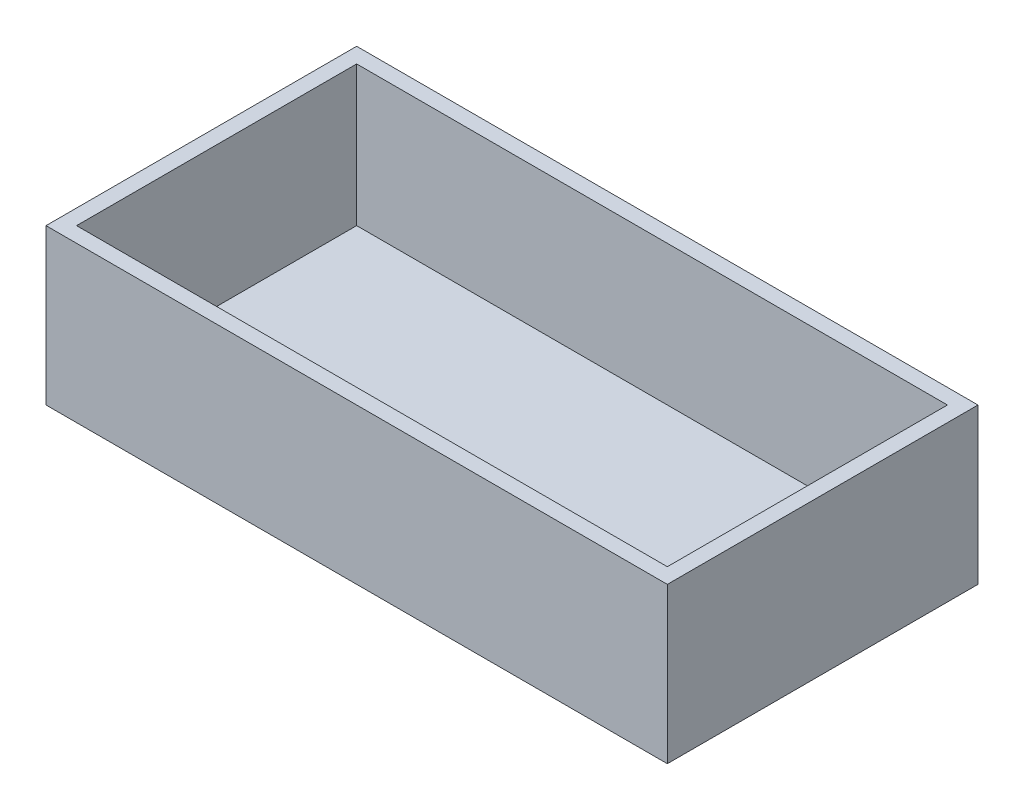
ISO-10303-21;
HEADER;
FILE_DESCRIPTION(('STEP AP214'),'2;1');
FILE_NAME('part.step','',(''),(''),'','','');
FILE_SCHEMA(('AUTOMOTIVE_DESIGN { 1 0 10303 214 1 1 1 1 }'));
ENDSEC;
DATA;
#1=APPLICATION_CONTEXT('core data for automotive mechanical design processes');
#2=APPLICATION_PROTOCOL_DEFINITION('international standard','automotive_design',2000,#1);
#3=PRODUCT_CONTEXT('',#1,'mechanical');
#4=PRODUCT('Part','Part','',(#3));
#5=PRODUCT_RELATED_PRODUCT_CATEGORY('part','',(#4));
#6=PRODUCT_DEFINITION_FORMATION('','',#4);
#7=PRODUCT_DEFINITION_CONTEXT('part definition',#1,'design');
#8=PRODUCT_DEFINITION('design','',#6,#7);
#9=PRODUCT_DEFINITION_SHAPE('','',#8);
#10=(LENGTH_UNIT() NAMED_UNIT(*) SI_UNIT(.MILLI.,.METRE.));
#11=(NAMED_UNIT(*) PLANE_ANGLE_UNIT() SI_UNIT($,.RADIAN.));
#12=(NAMED_UNIT(*) SI_UNIT($,.STERADIAN.) SOLID_ANGLE_UNIT());
#13=UNCERTAINTY_MEASURE_WITH_UNIT(LENGTH_MEASURE(1.E-05),#10,'distance_accuracy_value','');
#14=(GEOMETRIC_REPRESENTATION_CONTEXT(3) GLOBAL_UNCERTAINTY_ASSIGNED_CONTEXT((#13)) GLOBAL_UNIT_ASSIGNED_CONTEXT((#10,
#11,#12)) REPRESENTATION_CONTEXT('',''));
#15=CARTESIAN_POINT('',(0.,0.,0.));
#16=DIRECTION('',(0.,0.,1.));
#17=DIRECTION('',(1.,0.,0.));
#18=AXIS2_PLACEMENT_3D('',#15,#16,#17);
#19=CARTESIAN_POINT('',(0.,50.8,0.));
#20=DIRECTION('',(0.,-1.,0.));
#21=DIRECTION('',(0.,0.,-1.));
#22=AXIS2_PLACEMENT_3D('',#19,#20,#21);
#23=PLANE('',#22);
#24=DIRECTION('',(0.,0.,-1.));
#25=VECTOR('',#24,1.);
#26=CARTESIAN_POINT('',(101.6,50.8,50.8));
#27=LINE('',#26,#25);
#28=CARTESIAN_POINT('',(101.6,50.8,50.8));
#29=VERTEX_POINT('',#28);
#30=CARTESIAN_POINT('',(101.6,50.8,-50.8));
#31=VERTEX_POINT('',#30);
#32=EDGE_CURVE('E163',#29,#31,#27,.T.);
#33=ORIENTED_EDGE('',*,*,#32,.T.);
#34=DIRECTION('',(-1.,0.,0.));
#35=VECTOR('',#34,1.);
#36=CARTESIAN_POINT('',(-101.6,50.8,-50.8));
#37=LINE('',#36,#35);
#38=CARTESIAN_POINT('',(-101.6,50.8,-50.8));
#39=VERTEX_POINT('',#38);
#40=EDGE_CURVE('E98',#31,#39,#37,.T.);
#41=ORIENTED_EDGE('',*,*,#40,.T.);
#42=DIRECTION('',(0.,0.,1.));
#43=VECTOR('',#42,1.);
#44=CARTESIAN_POINT('',(-101.6,50.8,50.8));
#45=LINE('',#44,#43);
#46=CARTESIAN_POINT('',(-101.6,50.8,50.8));
#47=VERTEX_POINT('',#46);
#48=EDGE_CURVE('E168',#39,#47,#45,.T.);
#49=ORIENTED_EDGE('',*,*,#48,.T.);
#50=DIRECTION('',(1.,0.,0.));
#51=VECTOR('',#50,1.);
#52=CARTESIAN_POINT('',(-101.6,50.8,50.8));
#53=LINE('',#52,#51);
#54=EDGE_CURVE('E70',#47,#29,#53,.T.);
#55=ORIENTED_EDGE('',*,*,#54,.T.);
#56=EDGE_LOOP('',(#33,#41,#49,#55));
#57=FACE_BOUND('',#56,.T.);
#58=DIRECTION('',(0.,0.,-1.));
#59=VECTOR('',#58,1.);
#60=CARTESIAN_POINT('',(96.6,50.8,0.));
#61=LINE('',#60,#59);
#62=CARTESIAN_POINT('',(96.6,50.8,45.8));
#63=VERTEX_POINT('',#62);
#64=CARTESIAN_POINT('',(96.6,50.8,-45.8));
#65=VERTEX_POINT('',#64);
#66=EDGE_CURVE('E147',#63,#65,#61,.T.);
#67=ORIENTED_EDGE('',*,*,#66,.F.);
#68=DIRECTION('',(1.,0.,0.));
#69=VECTOR('',#68,1.);
#70=CARTESIAN_POINT('',(0.,50.8,45.8));
#71=LINE('',#70,#69);
#72=CARTESIAN_POINT('',(-96.6,50.8,45.8));
#73=VERTEX_POINT('',#72);
#74=EDGE_CURVE('E160',#73,#63,#71,.T.);
#75=ORIENTED_EDGE('',*,*,#74,.F.);
#76=DIRECTION('',(0.,0.,1.));
#77=VECTOR('',#76,1.);
#78=CARTESIAN_POINT('',(-96.6,50.8,0.));
#79=LINE('',#78,#77);
#80=CARTESIAN_POINT('',(-96.6,50.8,-45.8));
#81=VERTEX_POINT('',#80);
#82=EDGE_CURVE('E157',#81,#73,#79,.T.);
#83=ORIENTED_EDGE('',*,*,#82,.F.);
#84=DIRECTION('',(-1.,0.,0.));
#85=VECTOR('',#84,1.);
#86=CARTESIAN_POINT('',(0.,50.8,-45.8));
#87=LINE('',#86,#85);
#88=EDGE_CURVE('E136',#65,#81,#87,.T.);
#89=ORIENTED_EDGE('',*,*,#88,.F.);
#90=EDGE_LOOP('',(#67,#75,#83,#89));
#91=FACE_BOUND('',#90,.T.);
#92=ADVANCED_FACE('F45',(#57,#91),#23,.F.);
#93=CARTESIAN_POINT('',(101.6,50.8,50.8));
#94=DIRECTION('',(-1.,0.,0.));
#95=DIRECTION('',(0.,0.,1.));
#96=AXIS2_PLACEMENT_3D('',#93,#94,#95);
#97=PLANE('',#96);
#98=DIRECTION('',(0.,0.,-1.));
#99=VECTOR('',#98,1.);
#100=CARTESIAN_POINT('',(101.6,0.,50.8));
#101=LINE('',#100,#99);
#102=CARTESIAN_POINT('',(101.6,0.,50.8));
#103=VERTEX_POINT('',#102);
#104=CARTESIAN_POINT('',(101.6,0.,-50.8));
#105=VERTEX_POINT('',#104);
#106=EDGE_CURVE('E174',#103,#105,#101,.T.);
#107=ORIENTED_EDGE('',*,*,#106,.T.);
#108=DIRECTION('',(0.,-1.,0.));
#109=VECTOR('',#108,1.);
#110=CARTESIAN_POINT('',(101.6,50.8,-50.8));
#111=LINE('',#110,#109);
#112=EDGE_CURVE('E11',#31,#105,#111,.T.);
#113=ORIENTED_EDGE('',*,*,#112,.F.);
#114=ORIENTED_EDGE('',*,*,#32,.F.);
#115=DIRECTION('',(0.,-1.,0.));
#116=VECTOR('',#115,1.);
#117=CARTESIAN_POINT('',(101.6,50.8,50.8));
#118=LINE('',#117,#116);
#119=EDGE_CURVE('E173',#29,#103,#118,.T.);
#120=ORIENTED_EDGE('',*,*,#119,.T.);
#121=EDGE_LOOP('',(#107,#113,#114,#120));
#122=FACE_BOUND('',#121,.T.);
#123=ADVANCED_FACE('F47',(#122),#97,.F.);
#124=CARTESIAN_POINT('',(-101.6,50.8,-50.8));
#125=DIRECTION('',(0.,0.,1.));
#126=DIRECTION('',(1.,0.,0.));
#127=AXIS2_PLACEMENT_3D('',#124,#125,#126);
#128=PLANE('',#127);
#129=DIRECTION('',(-1.,0.,0.));
#130=VECTOR('',#129,1.);
#131=CARTESIAN_POINT('',(-101.6,0.,-50.8));
#132=LINE('',#131,#130);
#133=CARTESIAN_POINT('',(-101.6,0.,-50.8));
#134=VERTEX_POINT('',#133);
#135=EDGE_CURVE('E178',#105,#134,#132,.T.);
#136=ORIENTED_EDGE('',*,*,#135,.T.);
#137=DIRECTION('',(0.,-1.,0.));
#138=VECTOR('',#137,1.);
#139=CARTESIAN_POINT('',(-101.6,50.8,-50.8));
#140=LINE('',#139,#138);
#141=EDGE_CURVE('E54',#39,#134,#140,.T.);
#142=ORIENTED_EDGE('',*,*,#141,.F.);
#143=ORIENTED_EDGE('',*,*,#40,.F.);
#144=ORIENTED_EDGE('',*,*,#112,.T.);
#145=EDGE_LOOP('',(#136,#142,#143,#144));
#146=FACE_BOUND('',#145,.T.);
#147=ADVANCED_FACE('F212',(#146),#128,.F.);
#148=CARTESIAN_POINT('',(-101.6,50.8,50.8));
#149=DIRECTION('',(1.,0.,0.));
#150=DIRECTION('',(0.,0.,-1.));
#151=AXIS2_PLACEMENT_3D('',#148,#149,#150);
#152=PLANE('',#151);
#153=DIRECTION('',(0.,0.,1.));
#154=VECTOR('',#153,1.);
#155=CARTESIAN_POINT('',(-101.6,0.,50.8));
#156=LINE('',#155,#154);
#157=CARTESIAN_POINT('',(-101.6,0.,50.8));
#158=VERTEX_POINT('',#157);
#159=EDGE_CURVE('E181',#134,#158,#156,.T.);
#160=ORIENTED_EDGE('',*,*,#159,.T.);
#161=DIRECTION('',(0.,-1.,0.));
#162=VECTOR('',#161,1.);
#163=CARTESIAN_POINT('',(-101.6,50.8,50.8));
#164=LINE('',#163,#162);
#165=EDGE_CURVE('E188',#47,#158,#164,.T.);
#166=ORIENTED_EDGE('',*,*,#165,.F.);
#167=ORIENTED_EDGE('',*,*,#48,.F.);
#168=ORIENTED_EDGE('',*,*,#141,.T.);
#169=EDGE_LOOP('',(#160,#166,#167,#168));
#170=FACE_BOUND('',#169,.T.);
#171=ADVANCED_FACE('F195',(#170),#152,.F.);
#172=CARTESIAN_POINT('',(-101.6,50.8,50.8));
#173=DIRECTION('',(0.,0.,-1.));
#174=DIRECTION('',(-1.,0.,0.));
#175=AXIS2_PLACEMENT_3D('',#172,#173,#174);
#176=PLANE('',#175);
#177=DIRECTION('',(1.,0.,0.));
#178=VECTOR('',#177,1.);
#179=CARTESIAN_POINT('',(-101.6,0.,50.8));
#180=LINE('',#179,#178);
#181=EDGE_CURVE('E91',#158,#103,#180,.T.);
#182=ORIENTED_EDGE('',*,*,#181,.T.);
#183=ORIENTED_EDGE('',*,*,#119,.F.);
#184=ORIENTED_EDGE('',*,*,#54,.F.);
#185=ORIENTED_EDGE('',*,*,#165,.T.);
#186=EDGE_LOOP('',(#182,#183,#184,#185));
#187=FACE_BOUND('',#186,.T.);
#188=ADVANCED_FACE('F203',(#187),#176,.F.);
#189=CARTESIAN_POINT('',(0.,0.,0.));
#190=DIRECTION('',(0.,-1.,0.));
#191=DIRECTION('',(0.,0.,-1.));
#192=AXIS2_PLACEMENT_3D('',#189,#190,#191);
#193=PLANE('',#192);
#194=ORIENTED_EDGE('',*,*,#106,.F.);
#195=ORIENTED_EDGE('',*,*,#181,.F.);
#196=ORIENTED_EDGE('',*,*,#159,.F.);
#197=ORIENTED_EDGE('',*,*,#135,.F.);
#198=EDGE_LOOP('',(#194,#195,#196,#197));
#199=FACE_BOUND('',#198,.T.);
#200=ADVANCED_FACE('F199',(#199),#193,.T.);
#201=CARTESIAN_POINT('',(96.6,50.8,50.8));
#202=DIRECTION('',(-1.,0.,0.));
#203=DIRECTION('',(0.,0.,1.));
#204=AXIS2_PLACEMENT_3D('',#201,#202,#203);
#205=PLANE('',#204);
#206=DIRECTION('',(0.,0.,-1.));
#207=VECTOR('',#206,1.);
#208=CARTESIAN_POINT('',(96.6,5.,0.));
#209=LINE('',#208,#207);
#210=CARTESIAN_POINT('',(96.6,5.,45.8));
#211=VERTEX_POINT('',#210);
#212=CARTESIAN_POINT('',(96.6,5.,-45.8));
#213=VERTEX_POINT('',#212);
#214=EDGE_CURVE('E126',#211,#213,#209,.T.);
#215=ORIENTED_EDGE('',*,*,#214,.F.);
#216=DIRECTION('',(0.,-1.,0.));
#217=VECTOR('',#216,1.);
#218=CARTESIAN_POINT('',(96.6,50.8,45.8));
#219=LINE('',#218,#217);
#220=EDGE_CURVE('E151',#63,#211,#219,.T.);
#221=ORIENTED_EDGE('',*,*,#220,.F.);
#222=ORIENTED_EDGE('',*,*,#66,.T.);
#223=DIRECTION('',(0.,-1.,0.));
#224=VECTOR('',#223,1.);
#225=CARTESIAN_POINT('',(96.6,50.8,-45.8));
#226=LINE('',#225,#224);
#227=EDGE_CURVE('E140',#65,#213,#226,.T.);
#228=ORIENTED_EDGE('',*,*,#227,.T.);
#229=EDGE_LOOP('',(#215,#221,#222,#228));
#230=FACE_BOUND('',#229,.T.);
#231=ADVANCED_FACE('F210',(#230),#205,.T.);
#232=CARTESIAN_POINT('',(-101.6,50.8,-45.8));
#233=DIRECTION('',(0.,0.,1.));
#234=DIRECTION('',(1.,0.,0.));
#235=AXIS2_PLACEMENT_3D('',#232,#233,#234);
#236=PLANE('',#235);
#237=DIRECTION('',(-1.,0.,0.));
#238=VECTOR('',#237,1.);
#239=CARTESIAN_POINT('',(0.,5.,-45.8));
#240=LINE('',#239,#238);
#241=CARTESIAN_POINT('',(-96.6,5.,-45.8));
#242=VERTEX_POINT('',#241);
#243=EDGE_CURVE('E120',#213,#242,#240,.T.);
#244=ORIENTED_EDGE('',*,*,#243,.F.);
#245=ORIENTED_EDGE('',*,*,#227,.F.);
#246=ORIENTED_EDGE('',*,*,#88,.T.);
#247=DIRECTION('',(0.,-1.,0.));
#248=VECTOR('',#247,1.);
#249=CARTESIAN_POINT('',(-96.6,50.8,-45.8));
#250=LINE('',#249,#248);
#251=EDGE_CURVE('E133',#81,#242,#250,.T.);
#252=ORIENTED_EDGE('',*,*,#251,.T.);
#253=EDGE_LOOP('',(#244,#245,#246,#252));
#254=FACE_BOUND('',#253,.T.);
#255=ADVANCED_FACE('F134',(#254),#236,.T.);
#256=CARTESIAN_POINT('',(-96.6,50.8,50.8));
#257=DIRECTION('',(1.,0.,0.));
#258=DIRECTION('',(0.,0.,-1.));
#259=AXIS2_PLACEMENT_3D('',#256,#257,#258);
#260=PLANE('',#259);
#261=DIRECTION('',(0.,0.,1.));
#262=VECTOR('',#261,1.);
#263=CARTESIAN_POINT('',(-96.6,5.,0.));
#264=LINE('',#263,#262);
#265=CARTESIAN_POINT('',(-96.6,5.,45.8));
#266=VERTEX_POINT('',#265);
#267=EDGE_CURVE('E124',#242,#266,#264,.T.);
#268=ORIENTED_EDGE('',*,*,#267,.F.);
#269=ORIENTED_EDGE('',*,*,#251,.F.);
#270=ORIENTED_EDGE('',*,*,#82,.T.);
#271=DIRECTION('',(0.,-1.,0.));
#272=VECTOR('',#271,1.);
#273=CARTESIAN_POINT('',(-96.6,50.8,45.8));
#274=LINE('',#273,#272);
#275=EDGE_CURVE('E61',#73,#266,#274,.T.);
#276=ORIENTED_EDGE('',*,*,#275,.T.);
#277=EDGE_LOOP('',(#268,#269,#270,#276));
#278=FACE_BOUND('',#277,.T.);
#279=ADVANCED_FACE('F142',(#278),#260,.T.);
#280=CARTESIAN_POINT('',(-101.6,50.8,45.8));
#281=DIRECTION('',(0.,0.,-1.));
#282=DIRECTION('',(-1.,0.,0.));
#283=AXIS2_PLACEMENT_3D('',#280,#281,#282);
#284=PLANE('',#283);
#285=DIRECTION('',(1.,0.,0.));
#286=VECTOR('',#285,1.);
#287=CARTESIAN_POINT('',(0.,5.,45.8));
#288=LINE('',#287,#286);
#289=EDGE_CURVE('E144',#266,#211,#288,.T.);
#290=ORIENTED_EDGE('',*,*,#289,.F.);
#291=ORIENTED_EDGE('',*,*,#275,.F.);
#292=ORIENTED_EDGE('',*,*,#74,.T.);
#293=ORIENTED_EDGE('',*,*,#220,.T.);
#294=EDGE_LOOP('',(#290,#291,#292,#293));
#295=FACE_BOUND('',#294,.T.);
#296=ADVANCED_FACE('F224',(#295),#284,.T.);
#297=CARTESIAN_POINT('',(0.,5.,0.));
#298=DIRECTION('',(0.,-1.,0.));
#299=DIRECTION('',(0.,0.,-1.));
#300=AXIS2_PLACEMENT_3D('',#297,#298,#299);
#301=PLANE('',#300);
#302=ORIENTED_EDGE('',*,*,#214,.T.);
#303=ORIENTED_EDGE('',*,*,#243,.T.);
#304=ORIENTED_EDGE('',*,*,#267,.T.);
#305=ORIENTED_EDGE('',*,*,#289,.T.);
#306=EDGE_LOOP('',(#302,#303,#304,#305));
#307=FACE_BOUND('',#306,.T.);
#308=ADVANCED_FACE('F122',(#307),#301,.F.);
#309=CLOSED_SHELL('',(#92,#123,#147,#171,#188,#200,#231,#255,#279,#296,#308));
#310=MANIFOLD_SOLID_BREP('B2',#309);
#311=ADVANCED_BREP_SHAPE_REPRESENTATION('',(#18,#310),#14);
#312=SHAPE_DEFINITION_REPRESENTATION(#9,#311);
ENDSEC;
END-ISO-10303-21;
